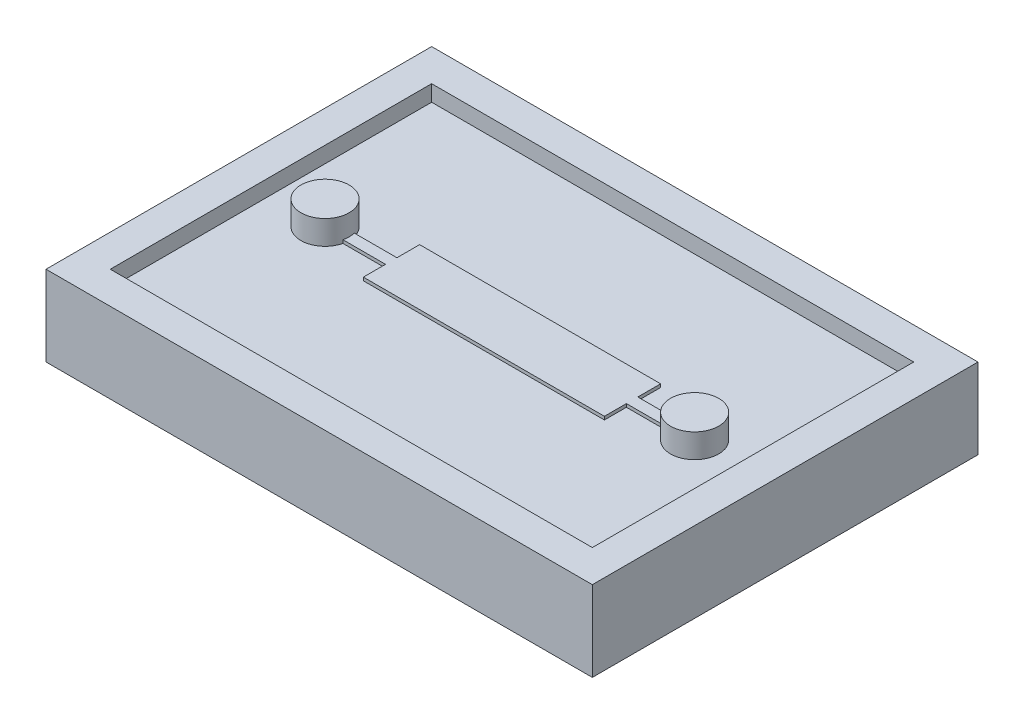
ISO-10303-21;
HEADER;
FILE_DESCRIPTION(('STEP AP214'),'2;1');
FILE_NAME('part.step','',(''),(''),'','','');
FILE_SCHEMA(('AUTOMOTIVE_DESIGN { 1 0 10303 214 1 1 1 1 }'));
ENDSEC;
DATA;
#1=APPLICATION_CONTEXT('core data for automotive mechanical design processes');
#2=APPLICATION_PROTOCOL_DEFINITION('international standard','automotive_design',2000,#1);
#3=PRODUCT_CONTEXT('',#1,'mechanical');
#4=PRODUCT('Part','Part','',(#3));
#5=PRODUCT_RELATED_PRODUCT_CATEGORY('part','',(#4));
#6=PRODUCT_DEFINITION_FORMATION('','',#4);
#7=PRODUCT_DEFINITION_CONTEXT('part definition',#1,'design');
#8=PRODUCT_DEFINITION('design','',#6,#7);
#9=PRODUCT_DEFINITION_SHAPE('','',#8);
#10=(LENGTH_UNIT() NAMED_UNIT(*) SI_UNIT(.MILLI.,.METRE.));
#11=(NAMED_UNIT(*) PLANE_ANGLE_UNIT() SI_UNIT($,.RADIAN.));
#12=(NAMED_UNIT(*) SI_UNIT($,.STERADIAN.) SOLID_ANGLE_UNIT());
#13=UNCERTAINTY_MEASURE_WITH_UNIT(LENGTH_MEASURE(1.E-05),#10,'distance_accuracy_value','');
#14=(GEOMETRIC_REPRESENTATION_CONTEXT(3) GLOBAL_UNCERTAINTY_ASSIGNED_CONTEXT((#13)) GLOBAL_UNIT_ASSIGNED_CONTEXT((#10,
#11,#12)) REPRESENTATION_CONTEXT('',''));
#15=CARTESIAN_POINT('',(0.,0.,0.));
#16=DIRECTION('',(0.,0.,1.));
#17=DIRECTION('',(1.,0.,0.));
#18=AXIS2_PLACEMENT_3D('',#15,#16,#17);
#19=CARTESIAN_POINT('',(0.,2.,0.));
#20=DIRECTION('',(0.,1.,0.));
#21=DIRECTION('',(0.,0.,1.));
#22=AXIS2_PLACEMENT_3D('',#19,#20,#21);
#23=PLANE('',#22);
#24=DIRECTION('',(0.,0.,-1.));
#25=VECTOR('',#24,1.);
#26=CARTESIAN_POINT('',(15.,2.,-9.99999999999999));
#27=LINE('',#26,#25);
#28=CARTESIAN_POINT('',(15.,2.,10.));
#29=VERTEX_POINT('',#28);
#30=CARTESIAN_POINT('',(15.,2.,-9.99999999999999));
#31=VERTEX_POINT('',#30);
#32=EDGE_CURVE('E283',#29,#31,#27,.T.);
#33=ORIENTED_EDGE('',*,*,#32,.T.);
#34=DIRECTION('',(-1.,0.,0.));
#35=VECTOR('',#34,1.);
#36=CARTESIAN_POINT('',(-15.,2.,-9.99999999999999));
#37=LINE('',#36,#35);
#38=CARTESIAN_POINT('',(-15.,2.,-9.99999999999999));
#39=VERTEX_POINT('',#38);
#40=EDGE_CURVE('E286',#31,#39,#37,.T.);
#41=ORIENTED_EDGE('',*,*,#40,.T.);
#42=DIRECTION('',(0.,0.,1.));
#43=VECTOR('',#42,1.);
#44=CARTESIAN_POINT('',(-15.,2.,-9.99999999999999));
#45=LINE('',#44,#43);
#46=CARTESIAN_POINT('',(-15.,2.,10.));
#47=VERTEX_POINT('',#46);
#48=EDGE_CURVE('E290',#39,#47,#45,.T.);
#49=ORIENTED_EDGE('',*,*,#48,.T.);
#50=DIRECTION('',(1.,0.,0.));
#51=VECTOR('',#50,1.);
#52=CARTESIAN_POINT('',(-15.,2.,10.));
#53=LINE('',#52,#51);
#54=EDGE_CURVE('E293',#47,#29,#53,.T.);
#55=ORIENTED_EDGE('',*,*,#54,.T.);
#56=EDGE_LOOP('',(#33,#41,#49,#55));
#57=FACE_BOUND('',#56,.T.);
#58=DIRECTION('',(-1.,0.,0.));
#59=VECTOR('',#58,1.);
#60=CARTESIAN_POINT('',(-7.5,2.,-1.75));
#61=LINE('',#60,#59);
#62=CARTESIAN_POINT('',(7.5,2.,-1.75));
#63=VERTEX_POINT('',#62);
#64=CARTESIAN_POINT('',(-7.5,2.,-1.75));
#65=VERTEX_POINT('',#64);
#66=EDGE_CURVE('E226',#63,#65,#61,.T.);
#67=ORIENTED_EDGE('',*,*,#66,.F.);
#68=DIRECTION('',(0.,0.,-1.));
#69=VECTOR('',#68,1.);
#70=CARTESIAN_POINT('',(7.5,2.,-1.75));
#71=LINE('',#70,#69);
#72=CARTESIAN_POINT('',(7.5,2.,-0.329434868167618));
#73=VERTEX_POINT('',#72);
#74=EDGE_CURVE('E212',#73,#63,#71,.T.);
#75=ORIENTED_EDGE('',*,*,#74,.F.);
#76=DIRECTION('',(-1.,0.,0.));
#77=VECTOR('',#76,1.);
#78=CARTESIAN_POINT('',(6.62948039700417,2.,-0.329434868167618));
#79=LINE('',#78,#77);
#80=CARTESIAN_POINT('',(9.93249407667439,2.,-0.329434868167618));
#81=VERTEX_POINT('',#80);
#82=EDGE_CURVE('E255',#81,#73,#79,.T.);
#83=ORIENTED_EDGE('',*,*,#82,.F.);
#84=CARTESIAN_POINT('',(11.3899958351873,2.,0.0250910461628223));
#85=DIRECTION('',(0.,1.,0.));
#86=DIRECTION('',(0.,0.,1.));
#87=AXIS2_PLACEMENT_3D('',#84,#85,#86);
#88=CIRCLE('',#87,1.5);
#89=CARTESIAN_POINT('',(9.93272503865789,2.,0.380565131832381));
#90=VERTEX_POINT('',#89);
#91=EDGE_CURVE('E267',#90,#81,#88,.T.);
#92=ORIENTED_EDGE('',*,*,#91,.F.);
#93=DIRECTION('',(1.,0.,0.));
#94=VECTOR('',#93,1.);
#95=CARTESIAN_POINT('',(6.62948039700417,2.,0.380565131832382));
#96=LINE('',#95,#94);
#97=CARTESIAN_POINT('',(7.5,2.,0.380565131832382));
#98=VERTEX_POINT('',#97);
#99=EDGE_CURVE('E252',#98,#90,#96,.T.);
#100=ORIENTED_EDGE('',*,*,#99,.F.);
#101=CARTESIAN_POINT('',(7.5,2.,1.75));
#102=VERTEX_POINT('',#101);
#103=EDGE_CURVE('E224',#102,#98,#71,.T.);
#104=ORIENTED_EDGE('',*,*,#103,.F.);
#105=DIRECTION('',(1.,0.,0.));
#106=VECTOR('',#105,1.);
#107=CARTESIAN_POINT('',(-7.5,2.,1.75));
#108=LINE('',#107,#106);
#109=CARTESIAN_POINT('',(-7.5,2.,1.75));
#110=VERTEX_POINT('',#109);
#111=EDGE_CURVE('E231',#110,#102,#108,.T.);
#112=ORIENTED_EDGE('',*,*,#111,.F.);
#113=DIRECTION('',(0.,0.,1.));
#114=VECTOR('',#113,1.);
#115=CARTESIAN_POINT('',(-7.5,2.,-1.75));
#116=LINE('',#115,#114);
#117=CARTESIAN_POINT('',(-7.5,2.,0.370629004381175));
#118=VERTEX_POINT('',#117);
#119=EDGE_CURVE('E228',#118,#110,#116,.T.);
#120=ORIENTED_EDGE('',*,*,#119,.F.);
#121=DIRECTION('',(1.,0.,0.));
#122=VECTOR('',#121,1.);
#123=CARTESIAN_POINT('',(-6.67559195115016,2.,0.370629004381175));
#124=LINE('',#123,#122);
#125=CARTESIAN_POINT('',(-10.1503454651742,2.,0.370629004381175));
#126=VERTEX_POINT('',#125);
#127=EDGE_CURVE('E264',#126,#118,#124,.T.);
#128=ORIENTED_EDGE('',*,*,#127,.F.);
#129=CARTESIAN_POINT('',(-11.6100041648127,2.,0.025091046162825));
#130=DIRECTION('',(0.,1.,0.));
#131=DIRECTION('',(0.,0.,1.));
#132=AXIS2_PLACEMENT_3D('',#129,#130,#131);
#133=CIRCLE('',#132,1.5);
#134=CARTESIAN_POINT('',(-10.1549552240206,2.,-0.339370995618825));
#135=VERTEX_POINT('',#134);
#136=EDGE_CURVE('E274',#135,#126,#133,.T.);
#137=ORIENTED_EDGE('',*,*,#136,.F.);
#138=DIRECTION('',(-1.,0.,0.));
#139=VECTOR('',#138,1.);
#140=CARTESIAN_POINT('',(-6.67559195115016,2.,-0.339370995618825));
#141=LINE('',#140,#139);
#142=CARTESIAN_POINT('',(-7.5,2.,-0.339370995618825));
#143=VERTEX_POINT('',#142);
#144=EDGE_CURVE('E258',#143,#135,#141,.T.);
#145=ORIENTED_EDGE('',*,*,#144,.F.);
#146=EDGE_CURVE('E229',#65,#143,#116,.T.);
#147=ORIENTED_EDGE('',*,*,#146,.F.);
#148=EDGE_LOOP('',(#67,#75,#83,#92,#100,#104,#112,#120,#128,#137,#145,#147));
#149=FACE_BOUND('',#148,.T.);
#150=ADVANCED_FACE('F45',(#57,#149),#23,.T.);
#151=CARTESIAN_POINT('',(-6.67559195115016,2.2,-0.339370995618825));
#152=DIRECTION('',(0.,0.,1.));
#153=DIRECTION('',(1.,0.,0.));
#154=AXIS2_PLACEMENT_3D('',#151,#152,#153);
#155=PLANE('',#154);
#156=DIRECTION('',(0.,1.,0.));
#157=VECTOR('',#156,1.);
#158=CARTESIAN_POINT('',(-7.5,2.2,-0.339370995618825));
#159=LINE('',#158,#157);
#160=CARTESIAN_POINT('',(-7.5,2.2,-0.339370995618825));
#161=VERTEX_POINT('',#160);
#162=EDGE_CURVE('E250',#143,#161,#159,.T.);
#163=ORIENTED_EDGE('',*,*,#162,.F.);
#164=ORIENTED_EDGE('',*,*,#144,.T.);
#165=DIRECTION('',(0.,-1.,0.));
#166=VECTOR('',#165,1.);
#167=CARTESIAN_POINT('',(-10.1549552240206,3.5,-0.339370995618825));
#168=LINE('',#167,#166);
#169=CARTESIAN_POINT('',(-10.1549552240206,2.2,-0.339370995618825));
#170=VERTEX_POINT('',#169);
#171=EDGE_CURVE('E330',#135,#170,#168,.F.);
#172=ORIENTED_EDGE('',*,*,#171,.T.);
#173=DIRECTION('',(-1.,0.,0.));
#174=VECTOR('',#173,1.);
#175=CARTESIAN_POINT('',(-6.67559195115016,2.2,-0.339370995618825));
#176=LINE('',#175,#174);
#177=EDGE_CURVE('E66',#161,#170,#176,.T.);
#178=ORIENTED_EDGE('',*,*,#177,.F.);
#179=EDGE_LOOP('',(#163,#164,#172,#178));
#180=FACE_BOUND('',#179,.T.);
#181=ADVANCED_FACE('F378',(#180),#155,.F.);
#182=CARTESIAN_POINT('',(-6.67559195115016,2.2,0.370629004381175));
#183=DIRECTION('',(0.,0.,-1.));
#184=DIRECTION('',(-1.,0.,0.));
#185=AXIS2_PLACEMENT_3D('',#182,#183,#184);
#186=PLANE('',#185);
#187=DIRECTION('',(0.,-1.,0.));
#188=VECTOR('',#187,1.);
#189=CARTESIAN_POINT('',(-7.5,2.2,0.370629004381175));
#190=LINE('',#189,#188);
#191=CARTESIAN_POINT('',(-7.5,2.2,0.370629004381175));
#192=VERTEX_POINT('',#191);
#193=EDGE_CURVE('E248',#192,#118,#190,.T.);
#194=ORIENTED_EDGE('',*,*,#193,.F.);
#195=DIRECTION('',(1.,0.,0.));
#196=VECTOR('',#195,1.);
#197=CARTESIAN_POINT('',(-6.67559195115016,2.2,0.370629004381175));
#198=LINE('',#197,#196);
#199=CARTESIAN_POINT('',(-10.1503454651742,2.2,0.370629004381175));
#200=VERTEX_POINT('',#199);
#201=EDGE_CURVE('E263',#200,#192,#198,.T.);
#202=ORIENTED_EDGE('',*,*,#201,.F.);
#203=DIRECTION('',(0.,-1.,0.));
#204=VECTOR('',#203,1.);
#205=CARTESIAN_POINT('',(-10.1503454651742,3.5,0.370629004381175));
#206=LINE('',#205,#204);
#207=EDGE_CURVE('E328',#200,#126,#206,.T.);
#208=ORIENTED_EDGE('',*,*,#207,.T.);
#209=ORIENTED_EDGE('',*,*,#127,.T.);
#210=EDGE_LOOP('',(#194,#202,#208,#209));
#211=FACE_BOUND('',#210,.T.);
#212=ADVANCED_FACE('F368',(#211),#186,.F.);
#213=CARTESIAN_POINT('',(6.62948039700417,2.2,0.380565131832382));
#214=DIRECTION('',(0.,0.,-1.));
#215=DIRECTION('',(-1.,0.,0.));
#216=AXIS2_PLACEMENT_3D('',#213,#214,#215);
#217=PLANE('',#216);
#218=DIRECTION('',(0.,1.,0.));
#219=VECTOR('',#218,1.);
#220=CARTESIAN_POINT('',(7.5,2.2,0.380565131832382));
#221=LINE('',#220,#219);
#222=CARTESIAN_POINT('',(7.5,2.2,0.380565131832382));
#223=VERTEX_POINT('',#222);
#224=EDGE_CURVE('E246',#98,#223,#221,.T.);
#225=ORIENTED_EDGE('',*,*,#224,.F.);
#226=ORIENTED_EDGE('',*,*,#99,.T.);
#227=DIRECTION('',(0.,-1.,0.));
#228=VECTOR('',#227,1.);
#229=CARTESIAN_POINT('',(9.93272503865789,3.5,0.380565131832381));
#230=LINE('',#229,#228);
#231=CARTESIAN_POINT('',(9.93272503865789,2.2,0.380565131832381));
#232=VERTEX_POINT('',#231);
#233=EDGE_CURVE('E11',#90,#232,#230,.F.);
#234=ORIENTED_EDGE('',*,*,#233,.T.);
#235=DIRECTION('',(1.,0.,0.));
#236=VECTOR('',#235,1.);
#237=CARTESIAN_POINT('',(6.62948039700417,2.2,0.380565131832382));
#238=LINE('',#237,#236);
#239=EDGE_CURVE('E60',#223,#232,#238,.T.);
#240=ORIENTED_EDGE('',*,*,#239,.F.);
#241=EDGE_LOOP('',(#225,#226,#234,#240));
#242=FACE_BOUND('',#241,.T.);
#243=ADVANCED_FACE('F350',(#242),#217,.F.);
#244=CARTESIAN_POINT('',(6.62948039700417,2.2,-0.329434868167618));
#245=DIRECTION('',(0.,0.,1.));
#246=DIRECTION('',(1.,0.,0.));
#247=AXIS2_PLACEMENT_3D('',#244,#245,#246);
#248=PLANE('',#247);
#249=DIRECTION('',(0.,-1.,0.));
#250=VECTOR('',#249,1.);
#251=CARTESIAN_POINT('',(7.5,2.2,-0.329434868167618));
#252=LINE('',#251,#250);
#253=CARTESIAN_POINT('',(7.5,2.2,-0.329434868167618));
#254=VERTEX_POINT('',#253);
#255=EDGE_CURVE('E244',#254,#73,#252,.T.);
#256=ORIENTED_EDGE('',*,*,#255,.F.);
#257=DIRECTION('',(-1.,0.,0.));
#258=VECTOR('',#257,1.);
#259=CARTESIAN_POINT('',(6.62948039700417,2.2,-0.329434868167618));
#260=LINE('',#259,#258);
#261=CARTESIAN_POINT('',(9.93249407667439,2.2,-0.329434868167618));
#262=VERTEX_POINT('',#261);
#263=EDGE_CURVE('E254',#262,#254,#260,.T.);
#264=ORIENTED_EDGE('',*,*,#263,.F.);
#265=DIRECTION('',(0.,-1.,0.));
#266=VECTOR('',#265,1.);
#267=CARTESIAN_POINT('',(9.93249407667439,3.5,-0.329434868167618));
#268=LINE('',#267,#266);
#269=EDGE_CURVE('E53',#262,#81,#268,.T.);
#270=ORIENTED_EDGE('',*,*,#269,.T.);
#271=ORIENTED_EDGE('',*,*,#82,.T.);
#272=EDGE_LOOP('',(#256,#264,#270,#271));
#273=FACE_BOUND('',#272,.T.);
#274=ADVANCED_FACE('F339',(#273),#248,.F.);
#275=CARTESIAN_POINT('',(11.3899958351873,3.5,0.0250910461628223));
#276=DIRECTION('',(0.,-1.,0.));
#277=DIRECTION('',(0.,0.,-1.));
#278=AXIS2_PLACEMENT_3D('',#275,#276,#277);
#279=CYLINDRICAL_SURFACE('',#278,1.5);
#280=CARTESIAN_POINT('',(11.3899958351873,3.5,0.0250910461628223));
#281=DIRECTION('',(0.,1.,0.));
#282=DIRECTION('',(0.,0.,1.));
#283=AXIS2_PLACEMENT_3D('',#280,#281,#282);
#284=CIRCLE('',#283,1.5);
#285=CARTESIAN_POINT('',(11.3899958351873,3.5,1.52509104616282));
#286=VERTEX_POINT('',#285);
#287=EDGE_CURVE('E271',#286,#286,#284,.T.);
#288=ORIENTED_EDGE('',*,*,#287,.F.);
#289=EDGE_LOOP('',(#288));
#290=FACE_BOUND('',#289,.T.);
#291=ORIENTED_EDGE('',*,*,#233,.F.);
#292=ORIENTED_EDGE('',*,*,#91,.T.);
#293=ORIENTED_EDGE('',*,*,#269,.F.);
#294=CARTESIAN_POINT('',(11.3899958351873,2.2,0.0250910461628223));
#295=DIRECTION('',(0.,1.,0.));
#296=DIRECTION('',(0.,0.,1.));
#297=AXIS2_PLACEMENT_3D('',#294,#295,#296);
#298=CIRCLE('',#297,1.5);
#299=EDGE_CURVE('E332',#262,#232,#298,.T.);
#300=ORIENTED_EDGE('',*,*,#299,.T.);
#301=EDGE_LOOP('',(#291,#292,#293,#300));
#302=FACE_BOUND('',#301,.T.);
#303=ADVANCED_FACE('F347',(#290,#302),#279,.T.);
#304=CARTESIAN_POINT('',(-11.6100041648127,3.5,0.025091046162825));
#305=DIRECTION('',(0.,-1.,0.));
#306=DIRECTION('',(0.,0.,-1.));
#307=AXIS2_PLACEMENT_3D('',#304,#305,#306);
#308=CYLINDRICAL_SURFACE('',#307,1.5);
#309=CARTESIAN_POINT('',(-11.6100041648127,3.5,0.025091046162825));
#310=DIRECTION('',(0.,1.,0.));
#311=DIRECTION('',(0.,0.,1.));
#312=AXIS2_PLACEMENT_3D('',#309,#310,#311);
#313=CIRCLE('',#312,1.5);
#314=CARTESIAN_POINT('',(-11.6100041648127,3.5,1.52509104616282));
#315=VERTEX_POINT('',#314);
#316=EDGE_CURVE('E277',#315,#315,#313,.T.);
#317=ORIENTED_EDGE('',*,*,#316,.F.);
#318=EDGE_LOOP('',(#317));
#319=FACE_BOUND('',#318,.T.);
#320=ORIENTED_EDGE('',*,*,#171,.F.);
#321=ORIENTED_EDGE('',*,*,#136,.T.);
#322=ORIENTED_EDGE('',*,*,#207,.F.);
#323=CARTESIAN_POINT('',(-11.6100041648127,2.2,0.025091046162825));
#324=DIRECTION('',(0.,1.,0.));
#325=DIRECTION('',(0.,0.,1.));
#326=AXIS2_PLACEMENT_3D('',#323,#324,#325);
#327=CIRCLE('',#326,1.5);
#328=EDGE_CURVE('E325',#200,#170,#327,.T.);
#329=ORIENTED_EDGE('',*,*,#328,.T.);
#330=EDGE_LOOP('',(#320,#321,#322,#329));
#331=FACE_BOUND('',#330,.T.);
#332=ADVANCED_FACE('F373',(#319,#331),#308,.T.);
#333=CARTESIAN_POINT('',(17.,3.,-12.));
#334=DIRECTION('',(-1.,0.,0.));
#335=DIRECTION('',(0.,0.,1.));
#336=AXIS2_PLACEMENT_3D('',#333,#334,#335);
#337=PLANE('',#336);
#338=DIRECTION('',(0.,-1.,0.));
#339=VECTOR('',#338,1.);
#340=CARTESIAN_POINT('',(17.,3.,12.));
#341=LINE('',#340,#339);
#342=CARTESIAN_POINT('',(17.,3.,12.));
#343=VERTEX_POINT('',#342);
#344=CARTESIAN_POINT('',(17.,-2.,12.));
#345=VERTEX_POINT('',#344);
#346=EDGE_CURVE('E183',#343,#345,#341,.T.);
#347=ORIENTED_EDGE('',*,*,#346,.T.);
#348=DIRECTION('',(0.,0.,1.));
#349=VECTOR('',#348,1.);
#350=CARTESIAN_POINT('',(17.,-2.,12.));
#351=LINE('',#350,#349);
#352=CARTESIAN_POINT('',(17.,-2.,-12.));
#353=VERTEX_POINT('',#352);
#354=EDGE_CURVE('E187',#353,#345,#351,.T.);
#355=ORIENTED_EDGE('',*,*,#354,.F.);
#356=DIRECTION('',(0.,-1.,0.));
#357=VECTOR('',#356,1.);
#358=CARTESIAN_POINT('',(17.,3.,-12.));
#359=LINE('',#358,#357);
#360=CARTESIAN_POINT('',(17.,3.,-12.));
#361=VERTEX_POINT('',#360);
#362=EDGE_CURVE('E323',#361,#353,#359,.T.);
#363=ORIENTED_EDGE('',*,*,#362,.F.);
#364=DIRECTION('',(0.,0.,-1.));
#365=VECTOR('',#364,1.);
#366=CARTESIAN_POINT('',(17.,3.,-12.));
#367=LINE('',#366,#365);
#368=EDGE_CURVE('E189',#343,#361,#367,.T.);
#369=ORIENTED_EDGE('',*,*,#368,.F.);
#370=EDGE_LOOP('',(#347,#355,#363,#369));
#371=FACE_BOUND('',#370,.T.);
#372=ADVANCED_FACE('F47',(#371),#337,.F.);
#373=CARTESIAN_POINT('',(-17.,3.,-12.));
#374=DIRECTION('',(0.,0.,1.));
#375=DIRECTION('',(1.,0.,0.));
#376=AXIS2_PLACEMENT_3D('',#373,#374,#375);
#377=PLANE('',#376);
#378=ORIENTED_EDGE('',*,*,#362,.T.);
#379=DIRECTION('',(1.,0.,0.));
#380=VECTOR('',#379,1.);
#381=CARTESIAN_POINT('',(-17.,-2.,-12.));
#382=LINE('',#381,#380);
#383=CARTESIAN_POINT('',(-17.,-2.,-12.));
#384=VERTEX_POINT('',#383);
#385=EDGE_CURVE('E207',#384,#353,#382,.T.);
#386=ORIENTED_EDGE('',*,*,#385,.F.);
#387=DIRECTION('',(0.,-1.,0.));
#388=VECTOR('',#387,1.);
#389=CARTESIAN_POINT('',(-17.,3.,-12.));
#390=LINE('',#389,#388);
#391=CARTESIAN_POINT('',(-17.,3.,-12.));
#392=VERTEX_POINT('',#391);
#393=EDGE_CURVE('E321',#392,#384,#390,.T.);
#394=ORIENTED_EDGE('',*,*,#393,.F.);
#395=DIRECTION('',(-1.,0.,0.));
#396=VECTOR('',#395,1.);
#397=CARTESIAN_POINT('',(-17.,3.,-12.));
#398=LINE('',#397,#396);
#399=EDGE_CURVE('E315',#361,#392,#398,.T.);
#400=ORIENTED_EDGE('',*,*,#399,.F.);
#401=EDGE_LOOP('',(#378,#386,#394,#400));
#402=FACE_BOUND('',#401,.T.);
#403=ADVANCED_FACE('F435',(#402),#377,.F.);
#404=CARTESIAN_POINT('',(-17.,3.,-12.));
#405=DIRECTION('',(1.,0.,0.));
#406=DIRECTION('',(0.,0.,-1.));
#407=AXIS2_PLACEMENT_3D('',#404,#405,#406);
#408=PLANE('',#407);
#409=ORIENTED_EDGE('',*,*,#393,.T.);
#410=DIRECTION('',(0.,0.,-1.));
#411=VECTOR('',#410,1.);
#412=CARTESIAN_POINT('',(-17.,-2.,12.));
#413=LINE('',#412,#411);
#414=CARTESIAN_POINT('',(-17.,-2.,12.));
#415=VERTEX_POINT('',#414);
#416=EDGE_CURVE('E202',#415,#384,#413,.T.);
#417=ORIENTED_EDGE('',*,*,#416,.F.);
#418=DIRECTION('',(0.,-1.,0.));
#419=VECTOR('',#418,1.);
#420=CARTESIAN_POINT('',(-17.,3.,12.));
#421=LINE('',#420,#419);
#422=CARTESIAN_POINT('',(-17.,3.,12.));
#423=VERTEX_POINT('',#422);
#424=EDGE_CURVE('E192',#423,#415,#421,.T.);
#425=ORIENTED_EDGE('',*,*,#424,.F.);
#426=DIRECTION('',(0.,0.,1.));
#427=VECTOR('',#426,1.);
#428=CARTESIAN_POINT('',(-17.,3.,-12.));
#429=LINE('',#428,#427);
#430=EDGE_CURVE('E317',#392,#423,#429,.T.);
#431=ORIENTED_EDGE('',*,*,#430,.F.);
#432=EDGE_LOOP('',(#409,#417,#425,#431));
#433=FACE_BOUND('',#432,.T.);
#434=ADVANCED_FACE('F433',(#433),#408,.F.);
#435=CARTESIAN_POINT('',(-17.,3.,12.));
#436=DIRECTION('',(0.,0.,-1.));
#437=DIRECTION('',(-1.,0.,0.));
#438=AXIS2_PLACEMENT_3D('',#435,#436,#437);
#439=PLANE('',#438);
#440=ORIENTED_EDGE('',*,*,#424,.T.);
#441=DIRECTION('',(-1.,0.,0.));
#442=VECTOR('',#441,1.);
#443=CARTESIAN_POINT('',(-17.,-2.,12.));
#444=LINE('',#443,#442);
#445=EDGE_CURVE('E196',#345,#415,#444,.T.);
#446=ORIENTED_EDGE('',*,*,#445,.F.);
#447=ORIENTED_EDGE('',*,*,#346,.F.);
#448=DIRECTION('',(1.,0.,0.));
#449=VECTOR('',#448,1.);
#450=CARTESIAN_POINT('',(-17.,3.,12.));
#451=LINE('',#450,#449);
#452=EDGE_CURVE('E193',#423,#343,#451,.T.);
#453=ORIENTED_EDGE('',*,*,#452,.F.);
#454=EDGE_LOOP('',(#440,#446,#447,#453));
#455=FACE_BOUND('',#454,.T.);
#456=ADVANCED_FACE('F197',(#455),#439,.F.);
#457=CARTESIAN_POINT('',(0.,3.,0.));
#458=DIRECTION('',(0.,1.,0.));
#459=DIRECTION('',(0.,0.,1.));
#460=AXIS2_PLACEMENT_3D('',#457,#458,#459);
#461=PLANE('',#460);
#462=DIRECTION('',(0.,0.,-1.));
#463=VECTOR('',#462,1.);
#464=CARTESIAN_POINT('',(15.,3.,-9.99999999999999));
#465=LINE('',#464,#463);
#466=CARTESIAN_POINT('',(15.,3.,10.));
#467=VERTEX_POINT('',#466);
#468=CARTESIAN_POINT('',(15.,3.,-9.99999999999999));
#469=VERTEX_POINT('',#468);
#470=EDGE_CURVE('E280',#467,#469,#465,.T.);
#471=ORIENTED_EDGE('',*,*,#470,.F.);
#472=DIRECTION('',(1.,0.,0.));
#473=VECTOR('',#472,1.);
#474=CARTESIAN_POINT('',(-15.,3.,10.));
#475=LINE('',#474,#473);
#476=CARTESIAN_POINT('',(-15.,3.,10.));
#477=VERTEX_POINT('',#476);
#478=EDGE_CURVE('E287',#477,#467,#475,.T.);
#479=ORIENTED_EDGE('',*,*,#478,.F.);
#480=DIRECTION('',(0.,0.,1.));
#481=VECTOR('',#480,1.);
#482=CARTESIAN_POINT('',(-15.,3.,-9.99999999999999));
#483=LINE('',#482,#481);
#484=CARTESIAN_POINT('',(-15.,3.,-9.99999999999999));
#485=VERTEX_POINT('',#484);
#486=EDGE_CURVE('E301',#485,#477,#483,.T.);
#487=ORIENTED_EDGE('',*,*,#486,.F.);
#488=DIRECTION('',(-1.,0.,0.));
#489=VECTOR('',#488,1.);
#490=CARTESIAN_POINT('',(-15.,3.,-9.99999999999999));
#491=LINE('',#490,#489);
#492=EDGE_CURVE('E298',#469,#485,#491,.T.);
#493=ORIENTED_EDGE('',*,*,#492,.F.);
#494=EDGE_LOOP('',(#471,#479,#487,#493));
#495=FACE_BOUND('',#494,.T.);
#496=ORIENTED_EDGE('',*,*,#368,.T.);
#497=ORIENTED_EDGE('',*,*,#399,.T.);
#498=ORIENTED_EDGE('',*,*,#430,.T.);
#499=ORIENTED_EDGE('',*,*,#452,.T.);
#500=EDGE_LOOP('',(#496,#497,#498,#499));
#501=FACE_BOUND('',#500,.T.);
#502=ADVANCED_FACE('F426',(#495,#501),#461,.T.);
#503=CARTESIAN_POINT('',(15.,2.,-9.99999999999999));
#504=DIRECTION('',(1.,0.,0.));
#505=DIRECTION('',(0.,0.,-1.));
#506=AXIS2_PLACEMENT_3D('',#503,#504,#505);
#507=PLANE('',#506);
#508=ORIENTED_EDGE('',*,*,#470,.T.);
#509=DIRECTION('',(0.,1.,0.));
#510=VECTOR('',#509,1.);
#511=CARTESIAN_POINT('',(15.,2.,-9.99999999999999));
#512=LINE('',#511,#510);
#513=EDGE_CURVE('E296',#31,#469,#512,.T.);
#514=ORIENTED_EDGE('',*,*,#513,.F.);
#515=ORIENTED_EDGE('',*,*,#32,.F.);
#516=DIRECTION('',(0.,1.,0.));
#517=VECTOR('',#516,1.);
#518=CARTESIAN_POINT('',(15.,2.,10.));
#519=LINE('',#518,#517);
#520=EDGE_CURVE('E306',#29,#467,#519,.T.);
#521=ORIENTED_EDGE('',*,*,#520,.T.);
#522=EDGE_LOOP('',(#508,#514,#515,#521));
#523=FACE_BOUND('',#522,.T.);
#524=ADVANCED_FACE('F414',(#523),#507,.F.);
#525=CARTESIAN_POINT('',(-15.,2.,10.));
#526=DIRECTION('',(0.,0.,1.));
#527=DIRECTION('',(1.,0.,0.));
#528=AXIS2_PLACEMENT_3D('',#525,#526,#527);
#529=PLANE('',#528);
#530=ORIENTED_EDGE('',*,*,#478,.T.);
#531=ORIENTED_EDGE('',*,*,#520,.F.);
#532=ORIENTED_EDGE('',*,*,#54,.F.);
#533=DIRECTION('',(0.,1.,0.));
#534=VECTOR('',#533,1.);
#535=CARTESIAN_POINT('',(-15.,2.,10.));
#536=LINE('',#535,#534);
#537=EDGE_CURVE('E308',#47,#477,#536,.T.);
#538=ORIENTED_EDGE('',*,*,#537,.T.);
#539=EDGE_LOOP('',(#530,#531,#532,#538));
#540=FACE_BOUND('',#539,.T.);
#541=ADVANCED_FACE('F410',(#540),#529,.F.);
#542=CARTESIAN_POINT('',(-15.,2.,-9.99999999999999));
#543=DIRECTION('',(-1.,0.,0.));
#544=DIRECTION('',(0.,0.,1.));
#545=AXIS2_PLACEMENT_3D('',#542,#543,#544);
#546=PLANE('',#545);
#547=ORIENTED_EDGE('',*,*,#486,.T.);
#548=ORIENTED_EDGE('',*,*,#537,.F.);
#549=ORIENTED_EDGE('',*,*,#48,.F.);
#550=DIRECTION('',(0.,1.,0.));
#551=VECTOR('',#550,1.);
#552=CARTESIAN_POINT('',(-15.,2.,-9.99999999999999));
#553=LINE('',#552,#551);
#554=EDGE_CURVE('E310',#39,#485,#553,.T.);
#555=ORIENTED_EDGE('',*,*,#554,.T.);
#556=EDGE_LOOP('',(#547,#548,#549,#555));
#557=FACE_BOUND('',#556,.T.);
#558=ADVANCED_FACE('F413',(#557),#546,.F.);
#559=CARTESIAN_POINT('',(-15.,2.,-9.99999999999999));
#560=DIRECTION('',(0.,0.,-1.));
#561=DIRECTION('',(-1.,0.,0.));
#562=AXIS2_PLACEMENT_3D('',#559,#560,#561);
#563=PLANE('',#562);
#564=ORIENTED_EDGE('',*,*,#492,.T.);
#565=ORIENTED_EDGE('',*,*,#554,.F.);
#566=ORIENTED_EDGE('',*,*,#40,.F.);
#567=ORIENTED_EDGE('',*,*,#513,.T.);
#568=EDGE_LOOP('',(#564,#565,#566,#567));
#569=FACE_BOUND('',#568,.T.);
#570=ADVANCED_FACE('F418',(#569),#563,.F.);
#571=CARTESIAN_POINT('',(-11.6100041648127,3.5,0.025091046162825));
#572=DIRECTION('',(0.,1.,0.));
#573=DIRECTION('',(0.,0.,1.));
#574=AXIS2_PLACEMENT_3D('',#571,#572,#573);
#575=PLANE('',#574);
#576=ORIENTED_EDGE('',*,*,#316,.T.);
#577=EDGE_LOOP('',(#576));
#578=FACE_BOUND('',#577,.T.);
#579=ADVANCED_FACE('F422',(#578),#575,.T.);
#580=CARTESIAN_POINT('',(11.3899958351873,3.5,0.0250910461628223));
#581=DIRECTION('',(0.,1.,0.));
#582=DIRECTION('',(0.,0.,1.));
#583=AXIS2_PLACEMENT_3D('',#580,#581,#582);
#584=PLANE('',#583);
#585=ORIENTED_EDGE('',*,*,#287,.T.);
#586=EDGE_LOOP('',(#585));
#587=FACE_BOUND('',#586,.T.);
#588=ADVANCED_FACE('F458',(#587),#584,.T.);
#589=CARTESIAN_POINT('',(0.,2.2,0.));
#590=DIRECTION('',(0.,1.,0.));
#591=DIRECTION('',(0.,0.,1.));
#592=AXIS2_PLACEMENT_3D('',#589,#590,#591);
#593=PLANE('',#592);
#594=DIRECTION('',(0.,0.,1.));
#595=VECTOR('',#594,1.);
#596=CARTESIAN_POINT('',(-7.5,2.2,-1.75));
#597=LINE('',#596,#595);
#598=CARTESIAN_POINT('',(-7.5,2.2,-1.75));
#599=VERTEX_POINT('',#598);
#600=EDGE_CURVE('E219',#599,#161,#597,.T.);
#601=ORIENTED_EDGE('',*,*,#600,.T.);
#602=ORIENTED_EDGE('',*,*,#177,.T.);
#603=ORIENTED_EDGE('',*,*,#328,.F.);
#604=ORIENTED_EDGE('',*,*,#201,.T.);
#605=CARTESIAN_POINT('',(-7.5,2.2,1.75));
#606=VERTEX_POINT('',#605);
#607=EDGE_CURVE('E218',#192,#606,#597,.T.);
#608=ORIENTED_EDGE('',*,*,#607,.T.);
#609=DIRECTION('',(1.,0.,0.));
#610=VECTOR('',#609,1.);
#611=CARTESIAN_POINT('',(-7.5,2.2,1.75));
#612=LINE('',#611,#610);
#613=CARTESIAN_POINT('',(7.5,2.2,1.75));
#614=VERTEX_POINT('',#613);
#615=EDGE_CURVE('E221',#606,#614,#612,.T.);
#616=ORIENTED_EDGE('',*,*,#615,.T.);
#617=DIRECTION('',(0.,0.,-1.));
#618=VECTOR('',#617,1.);
#619=CARTESIAN_POINT('',(7.5,2.2,-1.75));
#620=LINE('',#619,#618);
#621=EDGE_CURVE('E213',#614,#223,#620,.T.);
#622=ORIENTED_EDGE('',*,*,#621,.T.);
#623=ORIENTED_EDGE('',*,*,#239,.T.);
#624=ORIENTED_EDGE('',*,*,#299,.F.);
#625=ORIENTED_EDGE('',*,*,#263,.T.);
#626=CARTESIAN_POINT('',(7.5,2.2,-1.75));
#627=VERTEX_POINT('',#626);
#628=EDGE_CURVE('E216',#254,#627,#620,.T.);
#629=ORIENTED_EDGE('',*,*,#628,.T.);
#630=DIRECTION('',(-1.,0.,0.));
#631=VECTOR('',#630,1.);
#632=CARTESIAN_POINT('',(-7.5,2.2,-1.75));
#633=LINE('',#632,#631);
#634=EDGE_CURVE('E215',#627,#599,#633,.T.);
#635=ORIENTED_EDGE('',*,*,#634,.T.);
#636=EDGE_LOOP('',(#601,#602,#603,#604,#608,#616,#622,#623,#624,#625,#629,#635));
#637=FACE_BOUND('',#636,.T.);
#638=ADVANCED_FACE('F382',(#637),#593,.T.);
#639=CARTESIAN_POINT('',(-7.5,2.2,-1.75));
#640=DIRECTION('',(1.,0.,0.));
#641=DIRECTION('',(0.,0.,-1.));
#642=AXIS2_PLACEMENT_3D('',#639,#640,#641);
#643=PLANE('',#642);
#644=ORIENTED_EDGE('',*,*,#146,.T.);
#645=ORIENTED_EDGE('',*,*,#162,.T.);
#646=ORIENTED_EDGE('',*,*,#600,.F.);
#647=DIRECTION('',(0.,-1.,0.));
#648=VECTOR('',#647,1.);
#649=CARTESIAN_POINT('',(-7.5,2.2,-1.75));
#650=LINE('',#649,#648);
#651=EDGE_CURVE('E238',#599,#65,#650,.T.);
#652=ORIENTED_EDGE('',*,*,#651,.T.);
#653=EDGE_LOOP('',(#644,#645,#646,#652));
#654=FACE_BOUND('',#653,.T.);
#655=ADVANCED_FACE('F381',(#654),#643,.F.);
#656=ORIENTED_EDGE('',*,*,#607,.F.);
#657=ORIENTED_EDGE('',*,*,#193,.T.);
#658=ORIENTED_EDGE('',*,*,#119,.T.);
#659=DIRECTION('',(0.,-1.,0.));
#660=VECTOR('',#659,1.);
#661=CARTESIAN_POINT('',(-7.5,2.2,1.75));
#662=LINE('',#661,#660);
#663=EDGE_CURVE('E235',#606,#110,#662,.T.);
#664=ORIENTED_EDGE('',*,*,#663,.F.);
#665=EDGE_LOOP('',(#656,#657,#658,#664));
#666=FACE_BOUND('',#665,.T.);
#667=ADVANCED_FACE('F363',(#666),#643,.F.);
#668=CARTESIAN_POINT('',(7.5,2.2,-1.75));
#669=DIRECTION('',(-1.,0.,0.));
#670=DIRECTION('',(0.,0.,1.));
#671=AXIS2_PLACEMENT_3D('',#668,#669,#670);
#672=PLANE('',#671);
#673=ORIENTED_EDGE('',*,*,#103,.T.);
#674=ORIENTED_EDGE('',*,*,#224,.T.);
#675=ORIENTED_EDGE('',*,*,#621,.F.);
#676=DIRECTION('',(0.,-1.,0.));
#677=VECTOR('',#676,1.);
#678=CARTESIAN_POINT('',(7.5,2.2,1.75));
#679=LINE('',#678,#677);
#680=EDGE_CURVE('E223',#614,#102,#679,.T.);
#681=ORIENTED_EDGE('',*,*,#680,.T.);
#682=EDGE_LOOP('',(#673,#674,#675,#681));
#683=FACE_BOUND('',#682,.T.);
#684=ADVANCED_FACE('F355',(#683),#672,.F.);
#685=ORIENTED_EDGE('',*,*,#628,.F.);
#686=ORIENTED_EDGE('',*,*,#255,.T.);
#687=ORIENTED_EDGE('',*,*,#74,.T.);
#688=DIRECTION('',(0.,-1.,0.));
#689=VECTOR('',#688,1.);
#690=CARTESIAN_POINT('',(7.5,2.2,-1.75));
#691=LINE('',#690,#689);
#692=EDGE_CURVE('E241',#627,#63,#691,.T.);
#693=ORIENTED_EDGE('',*,*,#692,.F.);
#694=EDGE_LOOP('',(#685,#686,#687,#693));
#695=FACE_BOUND('',#694,.T.);
#696=ADVANCED_FACE('F389',(#695),#672,.F.);
#697=CARTESIAN_POINT('',(-7.5,2.2,-1.75));
#698=DIRECTION('',(0.,0.,1.));
#699=DIRECTION('',(1.,0.,0.));
#700=AXIS2_PLACEMENT_3D('',#697,#698,#699);
#701=PLANE('',#700);
#702=ORIENTED_EDGE('',*,*,#66,.T.);
#703=ORIENTED_EDGE('',*,*,#651,.F.);
#704=ORIENTED_EDGE('',*,*,#634,.F.);
#705=ORIENTED_EDGE('',*,*,#692,.T.);
#706=EDGE_LOOP('',(#702,#703,#704,#705));
#707=FACE_BOUND('',#706,.T.);
#708=ADVANCED_FACE('F387',(#707),#701,.F.);
#709=CARTESIAN_POINT('',(-7.5,2.2,1.75));
#710=DIRECTION('',(0.,0.,-1.));
#711=DIRECTION('',(-1.,0.,0.));
#712=AXIS2_PLACEMENT_3D('',#709,#710,#711);
#713=PLANE('',#712);
#714=ORIENTED_EDGE('',*,*,#111,.T.);
#715=ORIENTED_EDGE('',*,*,#680,.F.);
#716=ORIENTED_EDGE('',*,*,#615,.F.);
#717=ORIENTED_EDGE('',*,*,#663,.T.);
#718=EDGE_LOOP('',(#714,#715,#716,#717));
#719=FACE_BOUND('',#718,.T.);
#720=ADVANCED_FACE('F360',(#719),#713,.F.);
#721=CARTESIAN_POINT('',(0.,-2.,0.));
#722=DIRECTION('',(0.,-1.,0.));
#723=DIRECTION('',(0.,0.,-1.));
#724=AXIS2_PLACEMENT_3D('',#721,#722,#723);
#725=PLANE('',#724);
#726=ORIENTED_EDGE('',*,*,#354,.T.);
#727=ORIENTED_EDGE('',*,*,#445,.T.);
#728=ORIENTED_EDGE('',*,*,#416,.T.);
#729=ORIENTED_EDGE('',*,*,#385,.T.);
#730=EDGE_LOOP('',(#726,#727,#728,#729));
#731=FACE_BOUND('',#730,.T.);
#732=ADVANCED_FACE('F205',(#731),#725,.T.);
#733=CLOSED_SHELL('',(#150,#181,#212,#243,#274,#303,#332,#372,#403,#434,#456,#502,#524,#541,
#558,#570,#579,#588,#638,#655,#667,#684,#696,#708,#720,#732));
#734=MANIFOLD_SOLID_BREP('B2',#733);
#735=ADVANCED_BREP_SHAPE_REPRESENTATION('',(#18,#734),#14);
#736=SHAPE_DEFINITION_REPRESENTATION(#9,#735);
ENDSEC;
END-ISO-10303-21;
